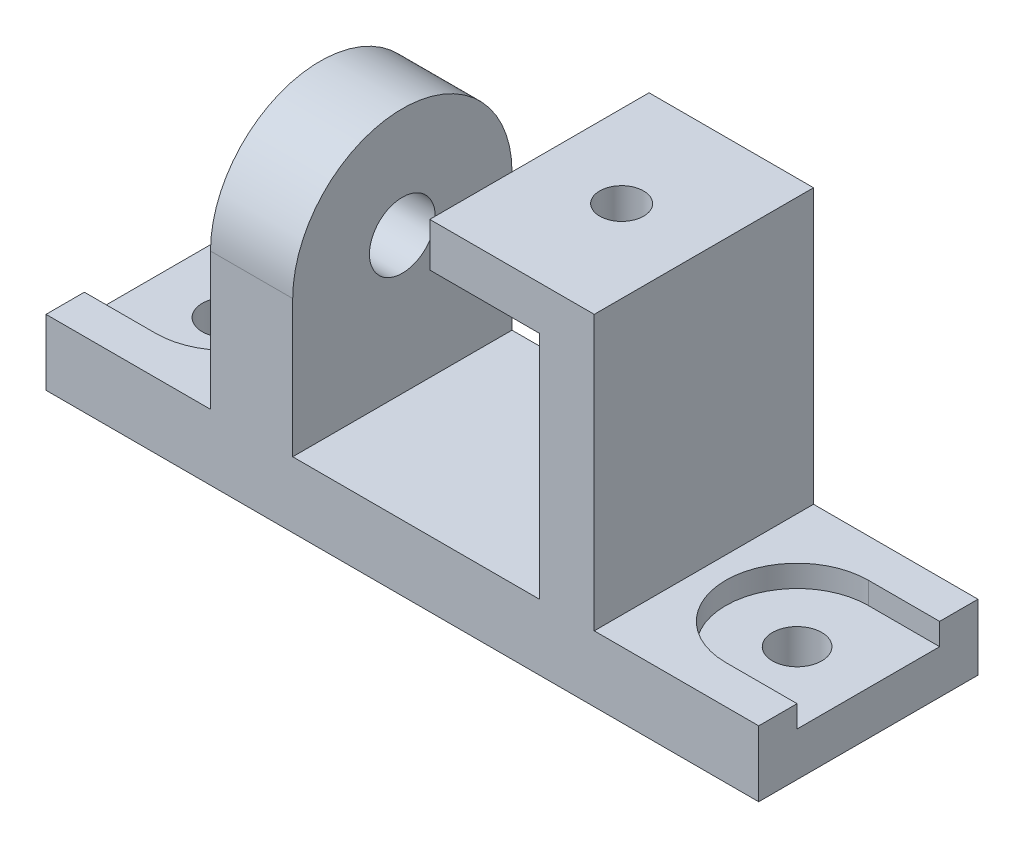
ISO-10303-21;
HEADER;
FILE_DESCRIPTION(('STEP AP214'),'2;1');
FILE_NAME('part.step','',(''),(''),'','','');
FILE_SCHEMA(('AUTOMOTIVE_DESIGN { 1 0 10303 214 1 1 1 1 }'));
ENDSEC;
DATA;
#1=APPLICATION_CONTEXT('core data for automotive mechanical design processes');
#2=APPLICATION_PROTOCOL_DEFINITION('international standard','automotive_design',2000,#1);
#3=PRODUCT_CONTEXT('',#1,'mechanical');
#4=PRODUCT('Part','Part','',(#3));
#5=PRODUCT_RELATED_PRODUCT_CATEGORY('part','',(#4));
#6=PRODUCT_DEFINITION_FORMATION('','',#4);
#7=PRODUCT_DEFINITION_CONTEXT('part definition',#1,'design');
#8=PRODUCT_DEFINITION('design','',#6,#7);
#9=PRODUCT_DEFINITION_SHAPE('','',#8);
#10=(LENGTH_UNIT() NAMED_UNIT(*) SI_UNIT(.MILLI.,.METRE.));
#11=(NAMED_UNIT(*) PLANE_ANGLE_UNIT() SI_UNIT($,.RADIAN.));
#12=(NAMED_UNIT(*) SI_UNIT($,.STERADIAN.) SOLID_ANGLE_UNIT());
#13=UNCERTAINTY_MEASURE_WITH_UNIT(LENGTH_MEASURE(1.E-05),#10,'distance_accuracy_value','');
#14=(GEOMETRIC_REPRESENTATION_CONTEXT(3) GLOBAL_UNCERTAINTY_ASSIGNED_CONTEXT((#13)) GLOBAL_UNIT_ASSIGNED_CONTEXT((#10,
#11,#12)) REPRESENTATION_CONTEXT('',''));
#15=CARTESIAN_POINT('',(0.,0.,0.));
#16=DIRECTION('',(0.,0.,1.));
#17=DIRECTION('',(1.,0.,0.));
#18=AXIS2_PLACEMENT_3D('',#15,#16,#17);
#19=CARTESIAN_POINT('',(-65.,12.,-20.0000000000001));
#20=DIRECTION('',(0.,0.,1.));
#21=DIRECTION('',(1.,0.,0.));
#22=AXIS2_PLACEMENT_3D('',#19,#20,#21);
#23=PLANE('',#22);
#24=DIRECTION('',(-1.,0.,0.));
#25=VECTOR('',#24,1.);
#26=CARTESIAN_POINT('',(-15.,37.,-20.0000000000001));
#27=LINE('',#26,#25);
#28=CARTESIAN_POINT('',(-20.,37.,-20.0000000000001));
#29=VERTEX_POINT('',#28);
#30=CARTESIAN_POINT('',(-35.,37.,-20.0000000000001));
#31=VERTEX_POINT('',#30);
#32=EDGE_CURVE('E185',#29,#31,#27,.T.);
#33=ORIENTED_EDGE('',*,*,#32,.F.);
#34=DIRECTION('',(0.,-1.,0.));
#35=VECTOR('',#34,1.);
#36=CARTESIAN_POINT('',(-20.,62.,-20.0000000000001));
#37=LINE('',#36,#35);
#38=CARTESIAN_POINT('',(-20.,12.,-20.0000000000001));
#39=VERTEX_POINT('',#38);
#40=EDGE_CURVE('E208',#29,#39,#37,.T.);
#41=ORIENTED_EDGE('',*,*,#40,.T.);
#42=DIRECTION('',(-1.,0.,0.));
#43=VECTOR('',#42,1.);
#44=CARTESIAN_POINT('',(-65.,12.,-20.0000000000001));
#45=LINE('',#44,#43);
#46=CARTESIAN_POINT('',(25.,12.,-20.0000000000001));
#47=VERTEX_POINT('',#46);
#48=EDGE_CURVE('E293',#47,#39,#45,.T.);
#49=ORIENTED_EDGE('',*,*,#48,.F.);
#50=DIRECTION('',(0.,-1.,0.));
#51=VECTOR('',#50,1.);
#52=CARTESIAN_POINT('',(25.,62.,-20.0000000000001));
#53=LINE('',#52,#51);
#54=CARTESIAN_POINT('',(25.,54.,-20.0000000000001));
#55=VERTEX_POINT('',#54);
#56=EDGE_CURVE('E56',#55,#47,#53,.T.);
#57=ORIENTED_EDGE('',*,*,#56,.F.);
#58=DIRECTION('',(1.,0.,0.));
#59=VECTOR('',#58,1.);
#60=CARTESIAN_POINT('',(4.99999999999999,54.,-20.0000000000001));
#61=LINE('',#60,#59);
#62=CARTESIAN_POINT('',(4.99999999999999,54.,-20.0000000000001));
#63=VERTEX_POINT('',#62);
#64=EDGE_CURVE('E345',#63,#55,#61,.T.);
#65=ORIENTED_EDGE('',*,*,#64,.F.);
#66=DIRECTION('',(0.,-1.,0.));
#67=VECTOR('',#66,1.);
#68=CARTESIAN_POINT('',(4.99999999999999,62.,-20.0000000000001));
#69=LINE('',#68,#67);
#70=CARTESIAN_POINT('',(4.99999999999999,62.,-20.0000000000001));
#71=VERTEX_POINT('',#70);
#72=EDGE_CURVE('E335',#71,#63,#69,.T.);
#73=ORIENTED_EDGE('',*,*,#72,.F.);
#74=DIRECTION('',(-1.,0.,0.));
#75=VECTOR('',#74,1.);
#76=CARTESIAN_POINT('',(25.,62.,-20.0000000000001));
#77=LINE('',#76,#75);
#78=CARTESIAN_POINT('',(35.,62.,-20.0000000000001));
#79=VERTEX_POINT('',#78);
#80=EDGE_CURVE('E353',#79,#71,#77,.T.);
#81=ORIENTED_EDGE('',*,*,#80,.F.);
#82=DIRECTION('',(0.,-1.,0.));
#83=VECTOR('',#82,1.);
#84=CARTESIAN_POINT('',(35.,62.,-20.0000000000001));
#85=LINE('',#84,#83);
#86=CARTESIAN_POINT('',(35.,12.,-20.0000000000001));
#87=VERTEX_POINT('',#86);
#88=EDGE_CURVE('E359',#79,#87,#85,.T.);
#89=ORIENTED_EDGE('',*,*,#88,.T.);
#90=CARTESIAN_POINT('',(65.0000000000004,12.,-20.0000000000001));
#91=VERTEX_POINT('',#90);
#92=EDGE_CURVE('E290',#91,#87,#45,.T.);
#93=ORIENTED_EDGE('',*,*,#92,.F.);
#94=DIRECTION('',(0.,-1.,0.));
#95=VECTOR('',#94,1.);
#96=CARTESIAN_POINT('',(65.0000000000004,12.,-20.0000000000001));
#97=LINE('',#96,#95);
#98=CARTESIAN_POINT('',(65.0000000000004,0.,-20.0000000000001));
#99=VERTEX_POINT('',#98);
#100=EDGE_CURVE('E42',#91,#99,#97,.T.);
#101=ORIENTED_EDGE('',*,*,#100,.T.);
#102=DIRECTION('',(-1.,0.,0.));
#103=VECTOR('',#102,1.);
#104=CARTESIAN_POINT('',(-65.,0.,-20.0000000000001));
#105=LINE('',#104,#103);
#106=CARTESIAN_POINT('',(-65.,0.,-20.0000000000001));
#107=VERTEX_POINT('',#106);
#108=EDGE_CURVE('E304',#99,#107,#105,.T.);
#109=ORIENTED_EDGE('',*,*,#108,.T.);
#110=DIRECTION('',(0.,-1.,0.));
#111=VECTOR('',#110,1.);
#112=CARTESIAN_POINT('',(-65.,12.,-20.0000000000001));
#113=LINE('',#112,#111);
#114=CARTESIAN_POINT('',(-65.,12.,-20.0000000000001));
#115=VERTEX_POINT('',#114);
#116=EDGE_CURVE('E315',#115,#107,#113,.T.);
#117=ORIENTED_EDGE('',*,*,#116,.F.);
#118=CARTESIAN_POINT('',(-35.,12.,-20.0000000000001));
#119=VERTEX_POINT('',#118);
#120=EDGE_CURVE('E288',#119,#115,#45,.T.);
#121=ORIENTED_EDGE('',*,*,#120,.F.);
#122=DIRECTION('',(0.,-1.,0.));
#123=VECTOR('',#122,1.);
#124=CARTESIAN_POINT('',(-35.,62.,-20.0000000000001));
#125=LINE('',#124,#123);
#126=EDGE_CURVE('E204',#31,#119,#125,.T.);
#127=ORIENTED_EDGE('',*,*,#126,.F.);
#128=EDGE_LOOP('',(#33,#41,#49,#57,#65,#73,#81,#89,#93,#101,#109,#117,#121,#127));
#129=FACE_BOUND('',#128,.T.);
#130=ADVANCED_FACE('F33',(#129),#23,.F.);
#131=CARTESIAN_POINT('',(-35.,62.,-20.0000000000001));
#132=DIRECTION('',(1.,0.,0.));
#133=DIRECTION('',(0.,0.,-1.));
#134=AXIS2_PLACEMENT_3D('',#131,#132,#133);
#135=PLANE('',#134);
#136=CARTESIAN_POINT('',(-35.,37.,0.));
#137=DIRECTION('',(-1.,0.,0.));
#138=DIRECTION('',(0.,0.,1.));
#139=AXIS2_PLACEMENT_3D('',#136,#137,#138);
#140=CIRCLE('',#139,6.);
#141=CARTESIAN_POINT('',(-35.,37.,5.99999999999993));
#142=VERTEX_POINT('',#141);
#143=EDGE_CURVE('E712',#142,#142,#140,.T.);
#144=ORIENTED_EDGE('',*,*,#143,.F.);
#145=EDGE_LOOP('',(#144));
#146=FACE_BOUND('',#145,.T.);
#147=CARTESIAN_POINT('',(-35.,37.,0.));
#148=DIRECTION('',(-1.,0.,0.));
#149=DIRECTION('',(0.,0.,1.));
#150=AXIS2_PLACEMENT_3D('',#147,#148,#149);
#151=CIRCLE('',#150,20.);
#152=CARTESIAN_POINT('',(-35.,37.,19.9999999999999));
#153=VERTEX_POINT('',#152);
#154=EDGE_CURVE('E182',#153,#31,#151,.T.);
#155=ORIENTED_EDGE('',*,*,#154,.T.);
#156=ORIENTED_EDGE('',*,*,#126,.T.);
#157=DIRECTION('',(0.,0.,1.));
#158=VECTOR('',#157,1.);
#159=CARTESIAN_POINT('',(-35.,12.,-20.0000000000001));
#160=LINE('',#159,#158);
#161=CARTESIAN_POINT('',(-35.,12.,20.));
#162=VERTEX_POINT('',#161);
#163=EDGE_CURVE('E203',#119,#162,#160,.T.);
#164=ORIENTED_EDGE('',*,*,#163,.T.);
#165=DIRECTION('',(0.,-1.,0.));
#166=VECTOR('',#165,1.);
#167=CARTESIAN_POINT('',(-35.,62.,20.));
#168=LINE('',#167,#166);
#169=EDGE_CURVE('E194',#153,#162,#168,.T.);
#170=ORIENTED_EDGE('',*,*,#169,.F.);
#171=EDGE_LOOP('',(#155,#156,#164,#170));
#172=FACE_BOUND('',#171,.T.);
#173=ADVANCED_FACE('F201',(#146,#172),#135,.F.);
#174=CARTESIAN_POINT('',(-20.,62.,-20.0000000000001));
#175=DIRECTION('',(1.,0.,0.));
#176=DIRECTION('',(0.,0.,-1.));
#177=AXIS2_PLACEMENT_3D('',#174,#175,#176);
#178=PLANE('',#177);
#179=CARTESIAN_POINT('',(-20.,37.,0.));
#180=DIRECTION('',(1.,0.,0.));
#181=DIRECTION('',(0.,0.,-1.));
#182=AXIS2_PLACEMENT_3D('',#179,#180,#181);
#183=CIRCLE('',#182,6.);
#184=CARTESIAN_POINT('',(-20.,37.,-6.00000000000007));
#185=VERTEX_POINT('',#184);
#186=EDGE_CURVE('E37',#185,#185,#183,.T.);
#187=ORIENTED_EDGE('',*,*,#186,.F.);
#188=EDGE_LOOP('',(#187));
#189=FACE_BOUND('',#188,.T.);
#190=ORIENTED_EDGE('',*,*,#40,.F.);
#191=CARTESIAN_POINT('',(-20.,37.,0.));
#192=DIRECTION('',(1.,0.,0.));
#193=DIRECTION('',(0.,0.,-1.));
#194=AXIS2_PLACEMENT_3D('',#191,#192,#193);
#195=CIRCLE('',#194,20.);
#196=CARTESIAN_POINT('',(-20.,37.,20.));
#197=VERTEX_POINT('',#196);
#198=EDGE_CURVE('E11',#29,#197,#195,.T.);
#199=ORIENTED_EDGE('',*,*,#198,.T.);
#200=DIRECTION('',(0.,-1.,0.));
#201=VECTOR('',#200,1.);
#202=CARTESIAN_POINT('',(-20.,62.,20.));
#203=LINE('',#202,#201);
#204=CARTESIAN_POINT('',(-20.,12.,20.));
#205=VERTEX_POINT('',#204);
#206=EDGE_CURVE('E197',#197,#205,#203,.T.);
#207=ORIENTED_EDGE('',*,*,#206,.T.);
#208=DIRECTION('',(0.,0.,1.));
#209=VECTOR('',#208,1.);
#210=CARTESIAN_POINT('',(-20.,12.,-20.0000000000001));
#211=LINE('',#210,#209);
#212=EDGE_CURVE('E367',#39,#205,#211,.T.);
#213=ORIENTED_EDGE('',*,*,#212,.F.);
#214=EDGE_LOOP('',(#190,#199,#207,#213));
#215=FACE_BOUND('',#214,.T.);
#216=ADVANCED_FACE('F462',(#189,#215),#178,.T.);
#217=CARTESIAN_POINT('',(25.,62.,20.));
#218=DIRECTION('',(1.,0.,0.));
#219=DIRECTION('',(0.,0.,-1.));
#220=AXIS2_PLACEMENT_3D('',#217,#218,#219);
#221=PLANE('',#220);
#222=DIRECTION('',(0.,0.,1.));
#223=VECTOR('',#222,1.);
#224=CARTESIAN_POINT('',(25.,54.,-20.0000000000001));
#225=LINE('',#224,#223);
#226=CARTESIAN_POINT('',(25.,54.,20.));
#227=VERTEX_POINT('',#226);
#228=EDGE_CURVE('E322',#55,#227,#225,.T.);
#229=ORIENTED_EDGE('',*,*,#228,.F.);
#230=ORIENTED_EDGE('',*,*,#56,.T.);
#231=DIRECTION('',(0.,0.,1.));
#232=VECTOR('',#231,1.);
#233=CARTESIAN_POINT('',(25.,12.,20.));
#234=LINE('',#233,#232);
#235=CARTESIAN_POINT('',(25.,12.,20.));
#236=VERTEX_POINT('',#235);
#237=EDGE_CURVE('E347',#47,#236,#234,.T.);
#238=ORIENTED_EDGE('',*,*,#237,.T.);
#239=DIRECTION('',(0.,-1.,0.));
#240=VECTOR('',#239,1.);
#241=CARTESIAN_POINT('',(25.,62.,20.));
#242=LINE('',#241,#240);
#243=EDGE_CURVE('E365',#227,#236,#242,.T.);
#244=ORIENTED_EDGE('',*,*,#243,.F.);
#245=EDGE_LOOP('',(#229,#230,#238,#244));
#246=FACE_BOUND('',#245,.T.);
#247=ADVANCED_FACE('F422',(#246),#221,.F.);
#248=CARTESIAN_POINT('',(0.,12.,0.));
#249=DIRECTION('',(0.,-1.,0.));
#250=DIRECTION('',(0.,0.,-1.));
#251=AXIS2_PLACEMENT_3D('',#248,#249,#250);
#252=PLANE('',#251);
#253=ORIENTED_EDGE('',*,*,#237,.F.);
#254=ORIENTED_EDGE('',*,*,#48,.T.);
#255=ORIENTED_EDGE('',*,*,#212,.T.);
#256=DIRECTION('',(1.,0.,0.));
#257=VECTOR('',#256,1.);
#258=CARTESIAN_POINT('',(-65.,12.,20.));
#259=LINE('',#258,#257);
#260=EDGE_CURVE('E301',#205,#236,#259,.T.);
#261=ORIENTED_EDGE('',*,*,#260,.T.);
#262=EDGE_LOOP('',(#253,#254,#255,#261));
#263=FACE_BOUND('',#262,.T.);
#264=ADVANCED_FACE('F373',(#263),#252,.F.);
#265=DIRECTION('',(0.,0.,-1.));
#266=VECTOR('',#265,1.);
#267=CARTESIAN_POINT('',(35.,12.,-20.0000000000001));
#268=LINE('',#267,#266);
#269=CARTESIAN_POINT('',(35.,12.,20.));
#270=VERTEX_POINT('',#269);
#271=EDGE_CURVE('E351',#270,#87,#268,.T.);
#272=ORIENTED_EDGE('',*,*,#271,.F.);
#273=CARTESIAN_POINT('',(65.0000000000004,12.,20.));
#274=VERTEX_POINT('',#273);
#275=EDGE_CURVE('E297',#270,#274,#259,.T.);
#276=ORIENTED_EDGE('',*,*,#275,.T.);
#277=DIRECTION('',(0.,0.,-1.));
#278=VECTOR('',#277,1.);
#279=CARTESIAN_POINT('',(65.0000000000004,12.,20.));
#280=LINE('',#279,#278);
#281=CARTESIAN_POINT('',(65.0000000000004,12.,13.));
#282=VERTEX_POINT('',#281);
#283=EDGE_CURVE('E285',#274,#282,#280,.T.);
#284=ORIENTED_EDGE('',*,*,#283,.T.);
#285=DIRECTION('',(-1.,0.,0.));
#286=VECTOR('',#285,1.);
#287=CARTESIAN_POINT('',(52.0000000000004,12.,13.));
#288=LINE('',#287,#286);
#289=CARTESIAN_POINT('',(52.0000000000004,12.,13.));
#290=VERTEX_POINT('',#289);
#291=EDGE_CURVE('E236',#282,#290,#288,.T.);
#292=ORIENTED_EDGE('',*,*,#291,.T.);
#293=CARTESIAN_POINT('',(52.0000000000004,12.,0.));
#294=DIRECTION('',(0.,-1.,0.));
#295=DIRECTION('',(0.,0.,-1.));
#296=AXIS2_PLACEMENT_3D('',#293,#294,#295);
#297=CIRCLE('',#296,13.);
#298=CARTESIAN_POINT('',(52.0000000000004,12.,-13.));
#299=VERTEX_POINT('',#298);
#300=EDGE_CURVE('E239',#290,#299,#297,.T.);
#301=ORIENTED_EDGE('',*,*,#300,.T.);
#302=DIRECTION('',(1.,0.,0.));
#303=VECTOR('',#302,1.);
#304=CARTESIAN_POINT('',(65.0000000000004,12.,-13.));
#305=LINE('',#304,#303);
#306=CARTESIAN_POINT('',(65.0000000000004,12.,-13.));
#307=VERTEX_POINT('',#306);
#308=EDGE_CURVE('E233',#299,#307,#305,.T.);
#309=ORIENTED_EDGE('',*,*,#308,.T.);
#310=EDGE_CURVE('E289',#307,#91,#280,.T.);
#311=ORIENTED_EDGE('',*,*,#310,.T.);
#312=ORIENTED_EDGE('',*,*,#92,.T.);
#313=EDGE_LOOP('',(#272,#276,#284,#292,#301,#309,#311,#312));
#314=FACE_BOUND('',#313,.T.);
#315=ADVANCED_FACE('F381',(#314),#252,.F.);
#316=ORIENTED_EDGE('',*,*,#163,.F.);
#317=ORIENTED_EDGE('',*,*,#120,.T.);
#318=DIRECTION('',(0.,0.,1.));
#319=VECTOR('',#318,1.);
#320=CARTESIAN_POINT('',(-65.,12.,20.));
#321=LINE('',#320,#319);
#322=CARTESIAN_POINT('',(-65.,12.,-13.));
#323=VERTEX_POINT('',#322);
#324=EDGE_CURVE('E294',#115,#323,#321,.T.);
#325=ORIENTED_EDGE('',*,*,#324,.T.);
#326=DIRECTION('',(1.,0.,0.));
#327=VECTOR('',#326,1.);
#328=CARTESIAN_POINT('',(-65.,12.,-13.));
#329=LINE('',#328,#327);
#330=CARTESIAN_POINT('',(-52.,12.,-13.));
#331=VERTEX_POINT('',#330);
#332=EDGE_CURVE('E267',#323,#331,#329,.T.);
#333=ORIENTED_EDGE('',*,*,#332,.T.);
#334=CARTESIAN_POINT('',(-52.,12.,0.));
#335=DIRECTION('',(0.,-1.,0.));
#336=DIRECTION('',(0.,0.,-1.));
#337=AXIS2_PLACEMENT_3D('',#334,#335,#336);
#338=CIRCLE('',#337,13.);
#339=CARTESIAN_POINT('',(-52.,12.,13.));
#340=VERTEX_POINT('',#339);
#341=EDGE_CURVE('E269',#331,#340,#338,.T.);
#342=ORIENTED_EDGE('',*,*,#341,.T.);
#343=DIRECTION('',(-1.,0.,0.));
#344=VECTOR('',#343,1.);
#345=CARTESIAN_POINT('',(-65.,12.,13.));
#346=LINE('',#345,#344);
#347=CARTESIAN_POINT('',(-65.,12.,13.));
#348=VERTEX_POINT('',#347);
#349=EDGE_CURVE('E264',#340,#348,#346,.T.);
#350=ORIENTED_EDGE('',*,*,#349,.T.);
#351=CARTESIAN_POINT('',(-65.,12.,20.));
#352=VERTEX_POINT('',#351);
#353=EDGE_CURVE('E292',#348,#352,#321,.T.);
#354=ORIENTED_EDGE('',*,*,#353,.T.);
#355=EDGE_CURVE('E298',#352,#162,#259,.T.);
#356=ORIENTED_EDGE('',*,*,#355,.T.);
#357=EDGE_LOOP('',(#316,#317,#325,#333,#342,#350,#354,#356));
#358=FACE_BOUND('',#357,.T.);
#359=ADVANCED_FACE('F425',(#358),#252,.F.);
#360=CARTESIAN_POINT('',(65.0000000000004,12.,20.));
#361=DIRECTION('',(-1.,0.,0.));
#362=DIRECTION('',(0.,0.,1.));
#363=AXIS2_PLACEMENT_3D('',#360,#361,#362);
#364=PLANE('',#363);
#365=DIRECTION('',(0.,-1.,0.));
#366=VECTOR('',#365,1.);
#367=CARTESIAN_POINT('',(65.0000000000004,182.678791886983,13.));
#368=LINE('',#367,#366);
#369=CARTESIAN_POINT('',(65.0000000000004,8.,13.));
#370=VERTEX_POINT('',#369);
#371=EDGE_CURVE('E249',#282,#370,#368,.T.);
#372=ORIENTED_EDGE('',*,*,#371,.F.);
#373=ORIENTED_EDGE('',*,*,#283,.F.);
#374=DIRECTION('',(0.,-1.,0.));
#375=VECTOR('',#374,1.);
#376=CARTESIAN_POINT('',(65.0000000000004,12.,20.));
#377=LINE('',#376,#375);
#378=CARTESIAN_POINT('',(65.0000000000004,0.,20.));
#379=VERTEX_POINT('',#378);
#380=EDGE_CURVE('E300',#274,#379,#377,.T.);
#381=ORIENTED_EDGE('',*,*,#380,.T.);
#382=DIRECTION('',(0.,0.,-1.));
#383=VECTOR('',#382,1.);
#384=CARTESIAN_POINT('',(65.0000000000004,0.,20.));
#385=LINE('',#384,#383);
#386=EDGE_CURVE('E282',#379,#99,#385,.T.);
#387=ORIENTED_EDGE('',*,*,#386,.T.);
#388=ORIENTED_EDGE('',*,*,#100,.F.);
#389=ORIENTED_EDGE('',*,*,#310,.F.);
#390=DIRECTION('',(0.,-1.,0.));
#391=VECTOR('',#390,1.);
#392=CARTESIAN_POINT('',(65.0000000000004,182.678791886983,-13.));
#393=LINE('',#392,#391);
#394=CARTESIAN_POINT('',(65.0000000000004,8.,-13.));
#395=VERTEX_POINT('',#394);
#396=EDGE_CURVE('E228',#307,#395,#393,.T.);
#397=ORIENTED_EDGE('',*,*,#396,.T.);
#398=DIRECTION('',(0.,0.,-1.));
#399=VECTOR('',#398,1.);
#400=CARTESIAN_POINT('',(65.0000000000004,8.,20.));
#401=LINE('',#400,#399);
#402=EDGE_CURVE('E222',#370,#395,#401,.T.);
#403=ORIENTED_EDGE('',*,*,#402,.F.);
#404=EDGE_LOOP('',(#372,#373,#381,#387,#388,#389,#397,#403));
#405=FACE_BOUND('',#404,.T.);
#406=ADVANCED_FACE('F35',(#405),#364,.F.);
#407=CARTESIAN_POINT('',(-65.,12.,20.));
#408=DIRECTION('',(1.,0.,0.));
#409=DIRECTION('',(0.,0.,-1.));
#410=AXIS2_PLACEMENT_3D('',#407,#408,#409);
#411=PLANE('',#410);
#412=DIRECTION('',(0.,-1.,0.));
#413=VECTOR('',#412,1.);
#414=CARTESIAN_POINT('',(-65.,197.678791886983,-13.));
#415=LINE('',#414,#413);
#416=CARTESIAN_POINT('',(-65.,8.,-13.));
#417=VERTEX_POINT('',#416);
#418=EDGE_CURVE('E276',#323,#417,#415,.T.);
#419=ORIENTED_EDGE('',*,*,#418,.F.);
#420=ORIENTED_EDGE('',*,*,#324,.F.);
#421=ORIENTED_EDGE('',*,*,#116,.T.);
#422=DIRECTION('',(0.,0.,1.));
#423=VECTOR('',#422,1.);
#424=CARTESIAN_POINT('',(-65.,0.,20.));
#425=LINE('',#424,#423);
#426=CARTESIAN_POINT('',(-65.,0.,20.));
#427=VERTEX_POINT('',#426);
#428=EDGE_CURVE('E306',#107,#427,#425,.T.);
#429=ORIENTED_EDGE('',*,*,#428,.T.);
#430=DIRECTION('',(0.,-1.,0.));
#431=VECTOR('',#430,1.);
#432=CARTESIAN_POINT('',(-65.,12.,20.));
#433=LINE('',#432,#431);
#434=EDGE_CURVE('E312',#352,#427,#433,.T.);
#435=ORIENTED_EDGE('',*,*,#434,.F.);
#436=ORIENTED_EDGE('',*,*,#353,.F.);
#437=DIRECTION('',(0.,-1.,0.));
#438=VECTOR('',#437,1.);
#439=CARTESIAN_POINT('',(-65.,197.678791886983,13.));
#440=LINE('',#439,#438);
#441=CARTESIAN_POINT('',(-65.,8.,13.));
#442=VERTEX_POINT('',#441);
#443=EDGE_CURVE('E259',#348,#442,#440,.T.);
#444=ORIENTED_EDGE('',*,*,#443,.T.);
#445=DIRECTION('',(0.,0.,1.));
#446=VECTOR('',#445,1.);
#447=CARTESIAN_POINT('',(-65.,8.,20.));
#448=LINE('',#447,#446);
#449=EDGE_CURVE('E254',#417,#442,#448,.T.);
#450=ORIENTED_EDGE('',*,*,#449,.F.);
#451=EDGE_LOOP('',(#419,#420,#421,#429,#435,#436,#444,#450));
#452=FACE_BOUND('',#451,.T.);
#453=ADVANCED_FACE('F430',(#452),#411,.F.);
#454=CARTESIAN_POINT('',(-65.,12.,20.));
#455=DIRECTION('',(0.,0.,-1.));
#456=DIRECTION('',(-1.,0.,0.));
#457=AXIS2_PLACEMENT_3D('',#454,#455,#456);
#458=PLANE('',#457);
#459=ORIENTED_EDGE('',*,*,#206,.F.);
#460=DIRECTION('',(-1.,0.,0.));
#461=VECTOR('',#460,1.);
#462=CARTESIAN_POINT('',(-15.,37.,19.9999999999999));
#463=LINE('',#462,#461);
#464=EDGE_CURVE('E49',#197,#153,#463,.T.);
#465=ORIENTED_EDGE('',*,*,#464,.T.);
#466=ORIENTED_EDGE('',*,*,#169,.T.);
#467=ORIENTED_EDGE('',*,*,#355,.F.);
#468=ORIENTED_EDGE('',*,*,#434,.T.);
#469=DIRECTION('',(1.,0.,0.));
#470=VECTOR('',#469,1.);
#471=CARTESIAN_POINT('',(-65.,0.,20.));
#472=LINE('',#471,#470);
#473=EDGE_CURVE('E308',#427,#379,#472,.T.);
#474=ORIENTED_EDGE('',*,*,#473,.T.);
#475=ORIENTED_EDGE('',*,*,#380,.F.);
#476=ORIENTED_EDGE('',*,*,#275,.F.);
#477=DIRECTION('',(0.,-1.,0.));
#478=VECTOR('',#477,1.);
#479=CARTESIAN_POINT('',(35.,62.,20.));
#480=LINE('',#479,#478);
#481=CARTESIAN_POINT('',(35.,62.,20.));
#482=VERTEX_POINT('',#481);
#483=EDGE_CURVE('E362',#482,#270,#480,.T.);
#484=ORIENTED_EDGE('',*,*,#483,.F.);
#485=DIRECTION('',(1.,0.,0.));
#486=VECTOR('',#485,1.);
#487=CARTESIAN_POINT('',(35.,62.,20.));
#488=LINE('',#487,#486);
#489=CARTESIAN_POINT('',(4.99999999999999,62.,20.));
#490=VERTEX_POINT('',#489);
#491=EDGE_CURVE('E348',#490,#482,#488,.T.);
#492=ORIENTED_EDGE('',*,*,#491,.F.);
#493=DIRECTION('',(0.,1.,0.));
#494=VECTOR('',#493,1.);
#495=CARTESIAN_POINT('',(4.99999999999999,54.,20.));
#496=LINE('',#495,#494);
#497=CARTESIAN_POINT('',(4.99999999999999,54.,20.));
#498=VERTEX_POINT('',#497);
#499=EDGE_CURVE('E339',#498,#490,#496,.T.);
#500=ORIENTED_EDGE('',*,*,#499,.F.);
#501=DIRECTION('',(1.,0.,0.));
#502=VECTOR('',#501,1.);
#503=CARTESIAN_POINT('',(4.99999999999999,54.,20.));
#504=LINE('',#503,#502);
#505=EDGE_CURVE('E341',#498,#227,#504,.T.);
#506=ORIENTED_EDGE('',*,*,#505,.T.);
#507=ORIENTED_EDGE('',*,*,#243,.T.);
#508=ORIENTED_EDGE('',*,*,#260,.F.);
#509=EDGE_LOOP('',(#459,#465,#466,#467,#468,#474,#475,#476,#484,#492,#500,#506,#507,#508));
#510=FACE_BOUND('',#509,.T.);
#511=ADVANCED_FACE('F192',(#510),#458,.F.);
#512=CARTESIAN_POINT('',(0.,0.,0.));
#513=DIRECTION('',(0.,-1.,0.));
#514=DIRECTION('',(0.,0.,-1.));
#515=AXIS2_PLACEMENT_3D('',#512,#513,#514);
#516=PLANE('',#515);
#517=CARTESIAN_POINT('',(52.0000000000004,0.,0.));
#518=DIRECTION('',(0.,1.,0.));
#519=DIRECTION('',(0.,0.,1.));
#520=AXIS2_PLACEMENT_3D('',#517,#518,#519);
#521=CIRCLE('',#520,4.5);
#522=CARTESIAN_POINT('',(52.0000000000004,0.,4.5));
#523=VERTEX_POINT('',#522);
#524=EDGE_CURVE('E213',#523,#523,#521,.T.);
#525=ORIENTED_EDGE('',*,*,#524,.T.);
#526=EDGE_LOOP('',(#525));
#527=FACE_BOUND('',#526,.T.);
#528=CARTESIAN_POINT('',(-52.,0.,0.));
#529=DIRECTION('',(0.,1.,0.));
#530=DIRECTION('',(0.,0.,1.));
#531=AXIS2_PLACEMENT_3D('',#528,#529,#530);
#532=CIRCLE('',#531,4.5);
#533=CARTESIAN_POINT('',(-52.,0.,4.5));
#534=VERTEX_POINT('',#533);
#535=EDGE_CURVE('E219',#534,#534,#532,.T.);
#536=ORIENTED_EDGE('',*,*,#535,.T.);
#537=EDGE_LOOP('',(#536));
#538=FACE_BOUND('',#537,.T.);
#539=ORIENTED_EDGE('',*,*,#386,.F.);
#540=ORIENTED_EDGE('',*,*,#473,.F.);
#541=ORIENTED_EDGE('',*,*,#428,.F.);
#542=ORIENTED_EDGE('',*,*,#108,.F.);
#543=EDGE_LOOP('',(#539,#540,#541,#542));
#544=FACE_BOUND('',#543,.T.);
#545=ADVANCED_FACE('F446',(#527,#538,#544),#516,.T.);
#546=CARTESIAN_POINT('',(-65.,197.678791886983,-13.));
#547=DIRECTION('',(0.,0.,1.));
#548=DIRECTION('',(1.,0.,0.));
#549=AXIS2_PLACEMENT_3D('',#546,#547,#548);
#550=PLANE('',#549);
#551=ORIENTED_EDGE('',*,*,#332,.F.);
#552=ORIENTED_EDGE('',*,*,#418,.T.);
#553=DIRECTION('',(1.,0.,0.));
#554=VECTOR('',#553,1.);
#555=CARTESIAN_POINT('',(-65.,8.00000000000001,-13.));
#556=LINE('',#555,#554);
#557=CARTESIAN_POINT('',(-52.,8.,-13.));
#558=VERTEX_POINT('',#557);
#559=EDGE_CURVE('E256',#417,#558,#556,.T.);
#560=ORIENTED_EDGE('',*,*,#559,.T.);
#561=DIRECTION('',(0.,-1.,0.));
#562=VECTOR('',#561,1.);
#563=CARTESIAN_POINT('',(-52.,197.678791886983,-13.));
#564=LINE('',#563,#562);
#565=EDGE_CURVE('E279',#331,#558,#564,.T.);
#566=ORIENTED_EDGE('',*,*,#565,.F.);
#567=EDGE_LOOP('',(#551,#552,#560,#566));
#568=FACE_BOUND('',#567,.T.);
#569=ADVANCED_FACE('F433',(#568),#550,.T.);
#570=CARTESIAN_POINT('',(-52.,197.678791886983,0.));
#571=DIRECTION('',(0.,-1.,0.));
#572=DIRECTION('',(0.,0.,-1.));
#573=AXIS2_PLACEMENT_3D('',#570,#571,#572);
#574=CYLINDRICAL_SURFACE('',#573,13.);
#575=ORIENTED_EDGE('',*,*,#341,.F.);
#576=ORIENTED_EDGE('',*,*,#565,.T.);
#577=CARTESIAN_POINT('',(-52.,8.00000000000001,0.));
#578=DIRECTION('',(0.,-1.,0.));
#579=DIRECTION('',(0.,0.,-1.));
#580=AXIS2_PLACEMENT_3D('',#577,#578,#579);
#581=CIRCLE('',#580,13.);
#582=CARTESIAN_POINT('',(-52.,8.00000000000001,13.));
#583=VERTEX_POINT('',#582);
#584=EDGE_CURVE('E260',#558,#583,#581,.T.);
#585=ORIENTED_EDGE('',*,*,#584,.T.);
#586=DIRECTION('',(0.,-1.,0.));
#587=VECTOR('',#586,1.);
#588=CARTESIAN_POINT('',(-52.,197.678791886983,13.));
#589=LINE('',#588,#587);
#590=EDGE_CURVE('E273',#340,#583,#589,.T.);
#591=ORIENTED_EDGE('',*,*,#590,.F.);
#592=EDGE_LOOP('',(#575,#576,#585,#591));
#593=FACE_BOUND('',#592,.T.);
#594=ADVANCED_FACE('F439',(#593),#574,.F.);
#595=CARTESIAN_POINT('',(-65.,197.678791886983,13.));
#596=DIRECTION('',(0.,0.,-1.));
#597=DIRECTION('',(-1.,0.,0.));
#598=AXIS2_PLACEMENT_3D('',#595,#596,#597);
#599=PLANE('',#598);
#600=ORIENTED_EDGE('',*,*,#349,.F.);
#601=ORIENTED_EDGE('',*,*,#590,.T.);
#602=DIRECTION('',(-1.,0.,0.));
#603=VECTOR('',#602,1.);
#604=CARTESIAN_POINT('',(-65.,8.00000000000001,13.));
#605=LINE('',#604,#603);
#606=EDGE_CURVE('E261',#583,#442,#605,.T.);
#607=ORIENTED_EDGE('',*,*,#606,.T.);
#608=ORIENTED_EDGE('',*,*,#443,.F.);
#609=EDGE_LOOP('',(#600,#601,#607,#608));
#610=FACE_BOUND('',#609,.T.);
#611=ADVANCED_FACE('F441',(#610),#599,.T.);
#612=CARTESIAN_POINT('',(0.,8.,0.));
#613=DIRECTION('',(0.,-1.,0.));
#614=DIRECTION('',(0.,0.,-1.));
#615=AXIS2_PLACEMENT_3D('',#612,#613,#614);
#616=PLANE('',#615);
#617=CARTESIAN_POINT('',(-52.,8.,0.));
#618=DIRECTION('',(0.,1.,0.));
#619=DIRECTION('',(0.,0.,1.));
#620=AXIS2_PLACEMENT_3D('',#617,#618,#619);
#621=CIRCLE('',#620,4.5);
#622=CARTESIAN_POINT('',(-52.,8.,4.5));
#623=VERTEX_POINT('',#622);
#624=EDGE_CURVE('E216',#623,#623,#621,.T.);
#625=ORIENTED_EDGE('',*,*,#624,.F.);
#626=EDGE_LOOP('',(#625));
#627=FACE_BOUND('',#626,.T.);
#628=ORIENTED_EDGE('',*,*,#449,.T.);
#629=ORIENTED_EDGE('',*,*,#606,.F.);
#630=ORIENTED_EDGE('',*,*,#584,.F.);
#631=ORIENTED_EDGE('',*,*,#559,.F.);
#632=EDGE_LOOP('',(#628,#629,#630,#631));
#633=FACE_BOUND('',#632,.T.);
#634=ADVANCED_FACE('F504',(#627,#633),#616,.F.);
#635=CARTESIAN_POINT('',(52.0000000000004,182.678791886983,13.));
#636=DIRECTION('',(0.,0.,-1.));
#637=DIRECTION('',(-1.,0.,0.));
#638=AXIS2_PLACEMENT_3D('',#635,#636,#637);
#639=PLANE('',#638);
#640=ORIENTED_EDGE('',*,*,#291,.F.);
#641=ORIENTED_EDGE('',*,*,#371,.T.);
#642=DIRECTION('',(-1.,0.,0.));
#643=VECTOR('',#642,1.);
#644=CARTESIAN_POINT('',(52.0000000000004,8.00000000000001,13.));
#645=LINE('',#644,#643);
#646=CARTESIAN_POINT('',(52.0000000000004,8.,13.));
#647=VERTEX_POINT('',#646);
#648=EDGE_CURVE('E225',#370,#647,#645,.T.);
#649=ORIENTED_EDGE('',*,*,#648,.T.);
#650=DIRECTION('',(0.,-1.,0.));
#651=VECTOR('',#650,1.);
#652=CARTESIAN_POINT('',(52.0000000000004,182.678791886983,13.));
#653=LINE('',#652,#651);
#654=EDGE_CURVE('E251',#290,#647,#653,.T.);
#655=ORIENTED_EDGE('',*,*,#654,.F.);
#656=EDGE_LOOP('',(#640,#641,#649,#655));
#657=FACE_BOUND('',#656,.T.);
#658=ADVANCED_FACE('F391',(#657),#639,.T.);
#659=CARTESIAN_POINT('',(52.0000000000004,182.678791886983,0.));
#660=DIRECTION('',(0.,-1.,0.));
#661=DIRECTION('',(0.,0.,-1.));
#662=AXIS2_PLACEMENT_3D('',#659,#660,#661);
#663=CYLINDRICAL_SURFACE('',#662,13.);
#664=ORIENTED_EDGE('',*,*,#300,.F.);
#665=ORIENTED_EDGE('',*,*,#654,.T.);
#666=CARTESIAN_POINT('',(52.0000000000004,8.00000000000001,0.));
#667=DIRECTION('',(0.,-1.,0.));
#668=DIRECTION('',(0.,0.,-1.));
#669=AXIS2_PLACEMENT_3D('',#666,#667,#668);
#670=CIRCLE('',#669,13.);
#671=CARTESIAN_POINT('',(52.0000000000004,8.00000000000001,-13.));
#672=VERTEX_POINT('',#671);
#673=EDGE_CURVE('E229',#647,#672,#670,.T.);
#674=ORIENTED_EDGE('',*,*,#673,.T.);
#675=DIRECTION('',(0.,-1.,0.));
#676=VECTOR('',#675,1.);
#677=CARTESIAN_POINT('',(52.0000000000004,182.678791886983,-13.));
#678=LINE('',#677,#676);
#679=EDGE_CURVE('E246',#299,#672,#678,.T.);
#680=ORIENTED_EDGE('',*,*,#679,.F.);
#681=EDGE_LOOP('',(#664,#665,#674,#680));
#682=FACE_BOUND('',#681,.T.);
#683=ADVANCED_FACE('F397',(#682),#663,.F.);
#684=CARTESIAN_POINT('',(65.0000000000004,182.678791886983,-13.));
#685=DIRECTION('',(0.,0.,1.));
#686=DIRECTION('',(1.,0.,0.));
#687=AXIS2_PLACEMENT_3D('',#684,#685,#686);
#688=PLANE('',#687);
#689=ORIENTED_EDGE('',*,*,#308,.F.);
#690=ORIENTED_EDGE('',*,*,#679,.T.);
#691=DIRECTION('',(1.,0.,0.));
#692=VECTOR('',#691,1.);
#693=CARTESIAN_POINT('',(65.0000000000004,8.00000000000001,-13.));
#694=LINE('',#693,#692);
#695=EDGE_CURVE('E230',#672,#395,#694,.T.);
#696=ORIENTED_EDGE('',*,*,#695,.T.);
#697=ORIENTED_EDGE('',*,*,#396,.F.);
#698=EDGE_LOOP('',(#689,#690,#696,#697));
#699=FACE_BOUND('',#698,.T.);
#700=ADVANCED_FACE('F399',(#699),#688,.T.);
#701=CARTESIAN_POINT('',(0.,8.,0.));
#702=DIRECTION('',(0.,-1.,0.));
#703=DIRECTION('',(0.,0.,-1.));
#704=AXIS2_PLACEMENT_3D('',#701,#702,#703);
#705=PLANE('',#704);
#706=CARTESIAN_POINT('',(52.0000000000004,8.,0.));
#707=DIRECTION('',(0.,1.,0.));
#708=DIRECTION('',(0.,0.,1.));
#709=AXIS2_PLACEMENT_3D('',#706,#707,#708);
#710=CIRCLE('',#709,4.5);
#711=CARTESIAN_POINT('',(52.0000000000004,8.,4.5));
#712=VERTEX_POINT('',#711);
#713=EDGE_CURVE('E206',#712,#712,#710,.T.);
#714=ORIENTED_EDGE('',*,*,#713,.F.);
#715=EDGE_LOOP('',(#714));
#716=FACE_BOUND('',#715,.T.);
#717=ORIENTED_EDGE('',*,*,#402,.T.);
#718=ORIENTED_EDGE('',*,*,#695,.F.);
#719=ORIENTED_EDGE('',*,*,#673,.F.);
#720=ORIENTED_EDGE('',*,*,#648,.F.);
#721=EDGE_LOOP('',(#717,#718,#719,#720));
#722=FACE_BOUND('',#721,.T.);
#723=ADVANCED_FACE('F394',(#716,#722),#705,.F.);
#724=CARTESIAN_POINT('',(-52.,0.,0.));
#725=DIRECTION('',(0.,1.,0.));
#726=DIRECTION('',(0.,0.,1.));
#727=AXIS2_PLACEMENT_3D('',#724,#725,#726);
#728=CYLINDRICAL_SURFACE('',#727,4.5);
#729=ORIENTED_EDGE('',*,*,#535,.F.);
#730=EDGE_LOOP('',(#729));
#731=FACE_BOUND('',#730,.T.);
#732=ORIENTED_EDGE('',*,*,#624,.T.);
#733=EDGE_LOOP('',(#732));
#734=FACE_BOUND('',#733,.T.);
#735=ADVANCED_FACE('F493',(#731,#734),#728,.F.);
#736=CARTESIAN_POINT('',(52.0000000000004,0.,0.));
#737=DIRECTION('',(0.,1.,0.));
#738=DIRECTION('',(0.,0.,1.));
#739=AXIS2_PLACEMENT_3D('',#736,#737,#738);
#740=CYLINDRICAL_SURFACE('',#739,4.5);
#741=ORIENTED_EDGE('',*,*,#524,.F.);
#742=EDGE_LOOP('',(#741));
#743=FACE_BOUND('',#742,.T.);
#744=ORIENTED_EDGE('',*,*,#713,.T.);
#745=EDGE_LOOP('',(#744));
#746=FACE_BOUND('',#745,.T.);
#747=ADVANCED_FACE('F490',(#743,#746),#740,.F.);
#748=CARTESIAN_POINT('',(35.,62.,-20.0000000000001));
#749=DIRECTION('',(-1.,0.,0.));
#750=DIRECTION('',(0.,0.,1.));
#751=AXIS2_PLACEMENT_3D('',#748,#749,#750);
#752=PLANE('',#751);
#753=ORIENTED_EDGE('',*,*,#271,.T.);
#754=ORIENTED_EDGE('',*,*,#88,.F.);
#755=DIRECTION('',(0.,0.,-1.));
#756=VECTOR('',#755,1.);
#757=CARTESIAN_POINT('',(35.,62.,-20.0000000000001));
#758=LINE('',#757,#756);
#759=EDGE_CURVE('E350',#482,#79,#758,.T.);
#760=ORIENTED_EDGE('',*,*,#759,.F.);
#761=ORIENTED_EDGE('',*,*,#483,.T.);
#762=EDGE_LOOP('',(#753,#754,#760,#761));
#763=FACE_BOUND('',#762,.T.);
#764=ADVANCED_FACE('F408',(#763),#752,.F.);
#765=CARTESIAN_POINT('',(0.,62.,0.));
#766=DIRECTION('',(0.,-1.,0.));
#767=DIRECTION('',(0.,0.,-1.));
#768=AXIS2_PLACEMENT_3D('',#765,#766,#767);
#769=PLANE('',#768);
#770=CARTESIAN_POINT('',(20.,62.,0.));
#771=DIRECTION('',(0.,1.,0.));
#772=DIRECTION('',(0.,0.,1.));
#773=AXIS2_PLACEMENT_3D('',#770,#771,#772);
#774=CIRCLE('',#773,4.);
#775=CARTESIAN_POINT('',(20.,62.,3.99999999999992));
#776=VERTEX_POINT('',#775);
#777=EDGE_CURVE('E198',#776,#776,#774,.T.);
#778=ORIENTED_EDGE('',*,*,#777,.F.);
#779=EDGE_LOOP('',(#778));
#780=FACE_BOUND('',#779,.T.);
#781=ORIENTED_EDGE('',*,*,#80,.T.);
#782=DIRECTION('',(0.,0.,-1.));
#783=VECTOR('',#782,1.);
#784=CARTESIAN_POINT('',(4.99999999999999,62.,20.));
#785=LINE('',#784,#783);
#786=EDGE_CURVE('E325',#490,#71,#785,.T.);
#787=ORIENTED_EDGE('',*,*,#786,.F.);
#788=ORIENTED_EDGE('',*,*,#491,.T.);
#789=ORIENTED_EDGE('',*,*,#759,.T.);
#790=EDGE_LOOP('',(#781,#787,#788,#789));
#791=FACE_BOUND('',#790,.T.);
#792=ADVANCED_FACE('F417',(#780,#791),#769,.F.);
#793=CARTESIAN_POINT('',(4.99999999999999,54.,-20.0000000000001));
#794=DIRECTION('',(0.,1.,0.));
#795=DIRECTION('',(0.,0.,1.));
#796=AXIS2_PLACEMENT_3D('',#793,#794,#795);
#797=PLANE('',#796);
#798=CARTESIAN_POINT('',(20.,54.,0.));
#799=DIRECTION('',(0.,1.,0.));
#800=DIRECTION('',(0.,0.,1.));
#801=AXIS2_PLACEMENT_3D('',#798,#799,#800);
#802=CIRCLE('',#801,4.);
#803=CARTESIAN_POINT('',(20.,54.,3.99999999999992));
#804=VERTEX_POINT('',#803);
#805=EDGE_CURVE('E320',#804,#804,#802,.T.);
#806=ORIENTED_EDGE('',*,*,#805,.T.);
#807=EDGE_LOOP('',(#806));
#808=FACE_BOUND('',#807,.T.);
#809=ORIENTED_EDGE('',*,*,#228,.T.);
#810=ORIENTED_EDGE('',*,*,#505,.F.);
#811=DIRECTION('',(0.,0.,1.));
#812=VECTOR('',#811,1.);
#813=CARTESIAN_POINT('',(4.99999999999999,54.,-20.0000000000001));
#814=LINE('',#813,#812);
#815=EDGE_CURVE('E337',#63,#498,#814,.T.);
#816=ORIENTED_EDGE('',*,*,#815,.F.);
#817=ORIENTED_EDGE('',*,*,#64,.T.);
#818=EDGE_LOOP('',(#809,#810,#816,#817));
#819=FACE_BOUND('',#818,.T.);
#820=ADVANCED_FACE('F421',(#808,#819),#797,.F.);
#821=CARTESIAN_POINT('',(4.99999999999999,0.,0.));
#822=DIRECTION('',(-1.,0.,0.));
#823=DIRECTION('',(0.,0.,1.));
#824=AXIS2_PLACEMENT_3D('',#821,#822,#823);
#825=PLANE('',#824);
#826=ORIENTED_EDGE('',*,*,#786,.T.);
#827=ORIENTED_EDGE('',*,*,#72,.T.);
#828=ORIENTED_EDGE('',*,*,#815,.T.);
#829=ORIENTED_EDGE('',*,*,#499,.T.);
#830=EDGE_LOOP('',(#826,#827,#828,#829));
#831=FACE_BOUND('',#830,.T.);
#832=ADVANCED_FACE('F414',(#831),#825,.T.);
#833=CARTESIAN_POINT('',(20.,42.,0.));
#834=DIRECTION('',(0.,1.,0.));
#835=DIRECTION('',(0.,0.,1.));
#836=AXIS2_PLACEMENT_3D('',#833,#834,#835);
#837=CYLINDRICAL_SURFACE('',#836,4.);
#838=ORIENTED_EDGE('',*,*,#777,.T.);
#839=EDGE_LOOP('',(#838));
#840=FACE_BOUND('',#839,.T.);
#841=ORIENTED_EDGE('',*,*,#805,.F.);
#842=EDGE_LOOP('',(#841));
#843=FACE_BOUND('',#842,.T.);
#844=ADVANCED_FACE('F569',(#840,#843),#837,.F.);
#845=CARTESIAN_POINT('',(-15.,37.,0.));
#846=DIRECTION('',(-1.,0.,0.));
#847=DIRECTION('',(0.,0.,1.));
#848=AXIS2_PLACEMENT_3D('',#845,#846,#847);
#849=CYLINDRICAL_SURFACE('',#848,20.);
#850=ORIENTED_EDGE('',*,*,#32,.T.);
#851=ORIENTED_EDGE('',*,*,#154,.F.);
#852=ORIENTED_EDGE('',*,*,#464,.F.);
#853=ORIENTED_EDGE('',*,*,#198,.F.);
#854=EDGE_LOOP('',(#850,#851,#852,#853));
#855=FACE_BOUND('',#854,.T.);
#856=ADVANCED_FACE('F183',(#855),#849,.T.);
#857=CARTESIAN_POINT('',(-15.,37.,0.));
#858=DIRECTION('',(-1.,0.,0.));
#859=DIRECTION('',(0.,0.,1.));
#860=AXIS2_PLACEMENT_3D('',#857,#858,#859);
#861=CYLINDRICAL_SURFACE('',#860,6.);
#862=ORIENTED_EDGE('',*,*,#186,.T.);
#863=EDGE_LOOP('',(#862));
#864=FACE_BOUND('',#863,.T.);
#865=ORIENTED_EDGE('',*,*,#143,.T.);
#866=EDGE_LOOP('',(#865));
#867=FACE_BOUND('',#866,.T.);
#868=ADVANCED_FACE('F581',(#864,#867),#861,.F.);
#869=CLOSED_SHELL('',(#130,#173,#216,#247,#264,#315,#359,#406,#453,#511,#545,#569,#594,#611,
#634,#658,#683,#700,#723,#735,#747,#764,#792,#820,#832,#844,#856,#868));
#870=MANIFOLD_SOLID_BREP('B2',#869);
#871=ADVANCED_BREP_SHAPE_REPRESENTATION('',(#18,#870),#14);
#872=SHAPE_DEFINITION_REPRESENTATION(#9,#871);
ENDSEC;
END-ISO-10303-21;
